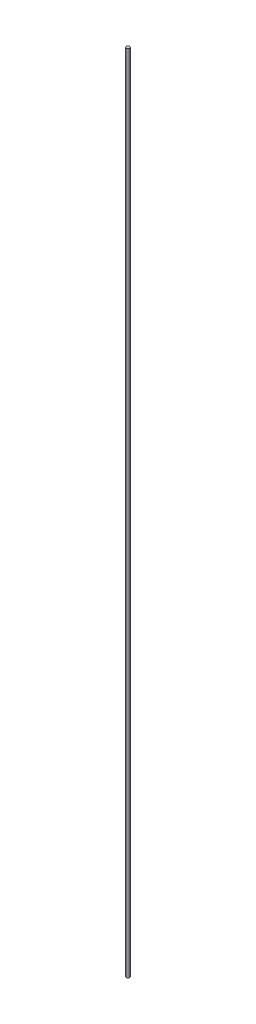
ISO-10303-21;
HEADER;
FILE_DESCRIPTION(('STEP AP214'),'2;1');
FILE_NAME('part.step','',(''),(''),'','','');
FILE_SCHEMA(('AUTOMOTIVE_DESIGN { 1 0 10303 214 1 1 1 1 }'));
ENDSEC;
DATA;
#1=APPLICATION_CONTEXT('core data for automotive mechanical design processes');
#2=APPLICATION_PROTOCOL_DEFINITION('international standard','automotive_design',2000,#1);
#3=PRODUCT_CONTEXT('',#1,'mechanical');
#4=PRODUCT('Part','Part','',(#3));
#5=PRODUCT_RELATED_PRODUCT_CATEGORY('part','',(#4));
#6=PRODUCT_DEFINITION_FORMATION('','',#4);
#7=PRODUCT_DEFINITION_CONTEXT('part definition',#1,'design');
#8=PRODUCT_DEFINITION('design','',#6,#7);
#9=PRODUCT_DEFINITION_SHAPE('','',#8);
#10=(LENGTH_UNIT() NAMED_UNIT(*) SI_UNIT(.MILLI.,.METRE.));
#11=(NAMED_UNIT(*) PLANE_ANGLE_UNIT() SI_UNIT($,.RADIAN.));
#12=(NAMED_UNIT(*) SI_UNIT($,.STERADIAN.) SOLID_ANGLE_UNIT());
#13=UNCERTAINTY_MEASURE_WITH_UNIT(LENGTH_MEASURE(1.E-05),#10,'distance_accuracy_value','');
#14=(GEOMETRIC_REPRESENTATION_CONTEXT(3) GLOBAL_UNCERTAINTY_ASSIGNED_CONTEXT((#13)) GLOBAL_UNIT_ASSIGNED_CONTEXT((#10,
#11,#12)) REPRESENTATION_CONTEXT('',''));
#15=CARTESIAN_POINT('',(0.,0.,0.));
#16=DIRECTION('',(0.,0.,1.));
#17=DIRECTION('',(1.,0.,0.));
#18=AXIS2_PLACEMENT_3D('',#15,#16,#17);
#19=CARTESIAN_POINT('',(0.,493.5,0.));
#20=DIRECTION('',(0.,-1.,0.));
#21=DIRECTION('',(0.,0.,-1.));
#22=AXIS2_PLACEMENT_3D('',#19,#20,#21);
#23=CYLINDRICAL_SURFACE('',#22,1.);
#24=CARTESIAN_POINT('',(0.,493.5,0.));
#25=DIRECTION('',(0.,1.,0.));
#26=DIRECTION('',(0.,0.,1.));
#27=AXIS2_PLACEMENT_3D('',#24,#25,#26);
#28=CIRCLE('',#27,1.);
#29=CARTESIAN_POINT('',(0.,493.5,1.));
#30=VERTEX_POINT('',#29);
#31=EDGE_CURVE('E10',#30,#30,#28,.T.);
#32=ORIENTED_EDGE('',*,*,#31,.F.);
#33=EDGE_LOOP('',(#32));
#34=FACE_BOUND('',#33,.T.);
#35=CARTESIAN_POINT('',(0.,0.,0.));
#36=DIRECTION('',(0.,1.,0.));
#37=DIRECTION('',(0.,0.,1.));
#38=AXIS2_PLACEMENT_3D('',#35,#36,#37);
#39=CIRCLE('',#38,1.);
#40=CARTESIAN_POINT('',(0.,0.,1.));
#41=VERTEX_POINT('',#40);
#42=EDGE_CURVE('E40',#41,#41,#39,.T.);
#43=ORIENTED_EDGE('',*,*,#42,.T.);
#44=EDGE_LOOP('',(#43));
#45=FACE_BOUND('',#44,.T.);
#46=ADVANCED_FACE('F37',(#34,#45),#23,.T.);
#47=CARTESIAN_POINT('',(0.,493.5,0.));
#48=DIRECTION('',(0.,1.,0.));
#49=DIRECTION('',(0.,0.,1.));
#50=AXIS2_PLACEMENT_3D('',#47,#48,#49);
#51=PLANE('',#50);
#52=ORIENTED_EDGE('',*,*,#31,.T.);
#53=EDGE_LOOP('',(#52));
#54=FACE_BOUND('',#53,.T.);
#55=ADVANCED_FACE('F54',(#54),#51,.T.);
#56=CARTESIAN_POINT('',(0.,0.,0.));
#57=DIRECTION('',(0.,1.,0.));
#58=DIRECTION('',(0.,0.,1.));
#59=AXIS2_PLACEMENT_3D('',#56,#57,#58);
#60=PLANE('',#59);
#61=ORIENTED_EDGE('',*,*,#42,.F.);
#62=EDGE_LOOP('',(#61));
#63=FACE_BOUND('',#62,.T.);
#64=ADVANCED_FACE('F52',(#63),#60,.F.);
#65=CLOSED_SHELL('',(#46,#55,#64));
#66=MANIFOLD_SOLID_BREP('B2',#65);
#67=ADVANCED_BREP_SHAPE_REPRESENTATION('',(#18,#66),#14);
#68=SHAPE_DEFINITION_REPRESENTATION(#9,#67);
ENDSEC;
END-ISO-10303-21;
